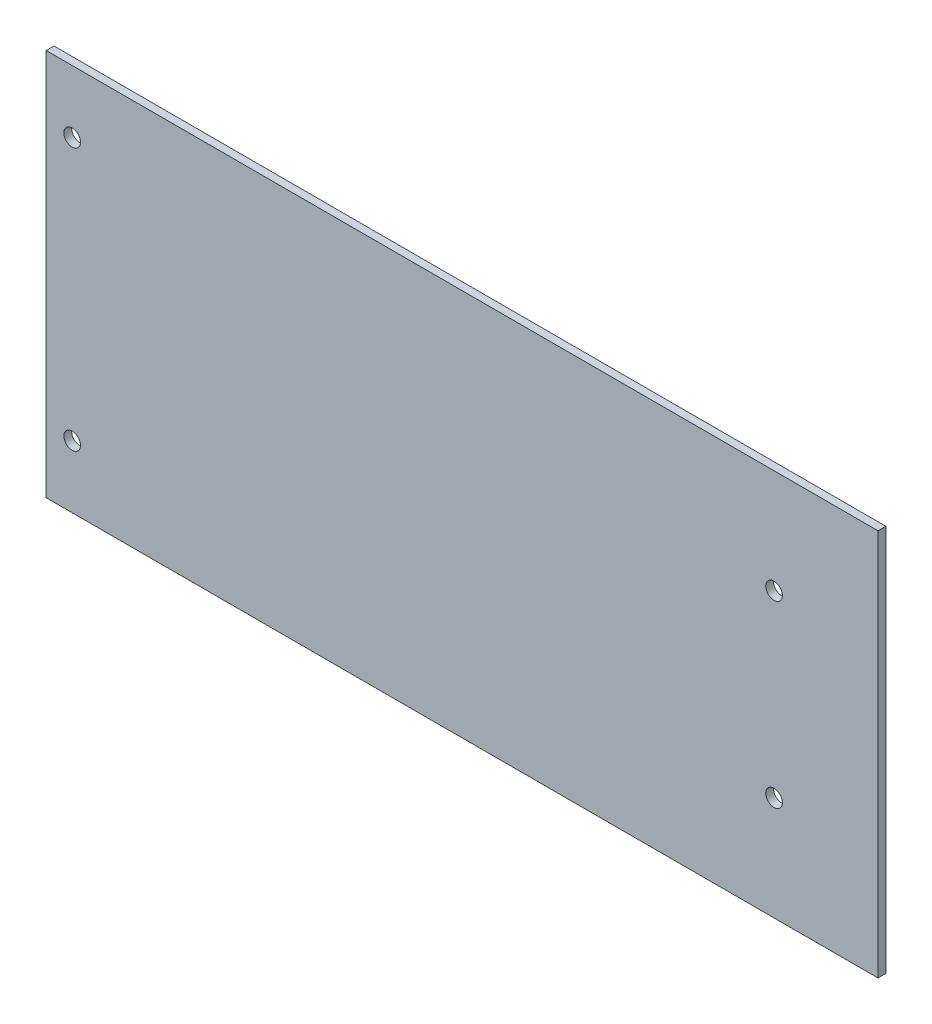
ISO-10303-21;
HEADER;
FILE_DESCRIPTION(('STEP AP214'),'2;1');
FILE_NAME('part.step','',(''),(''),'','','');
FILE_SCHEMA(('AUTOMOTIVE_DESIGN { 1 0 10303 214 1 1 1 1 }'));
ENDSEC;
DATA;
#1=APPLICATION_CONTEXT('core data for automotive mechanical design processes');
#2=APPLICATION_PROTOCOL_DEFINITION('international standard','automotive_design',2000,#1);
#3=PRODUCT_CONTEXT('',#1,'mechanical');
#4=PRODUCT('Part','Part','',(#3));
#5=PRODUCT_RELATED_PRODUCT_CATEGORY('part','',(#4));
#6=PRODUCT_DEFINITION_FORMATION('','',#4);
#7=PRODUCT_DEFINITION_CONTEXT('part definition',#1,'design');
#8=PRODUCT_DEFINITION('design','',#6,#7);
#9=PRODUCT_DEFINITION_SHAPE('','',#8);
#10=(LENGTH_UNIT() NAMED_UNIT(*) SI_UNIT(.MILLI.,.METRE.));
#11=(NAMED_UNIT(*) PLANE_ANGLE_UNIT() SI_UNIT($,.RADIAN.));
#12=(NAMED_UNIT(*) SI_UNIT($,.STERADIAN.) SOLID_ANGLE_UNIT());
#13=UNCERTAINTY_MEASURE_WITH_UNIT(LENGTH_MEASURE(1.E-05),#10,'distance_accuracy_value','');
#14=(GEOMETRIC_REPRESENTATION_CONTEXT(3) GLOBAL_UNCERTAINTY_ASSIGNED_CONTEXT((#13)) GLOBAL_UNIT_ASSIGNED_CONTEXT((#10,
#11,#12)) REPRESENTATION_CONTEXT('',''));
#15=CARTESIAN_POINT('',(0.,0.,0.));
#16=DIRECTION('',(0.,0.,1.));
#17=DIRECTION('',(1.,0.,0.));
#18=AXIS2_PLACEMENT_3D('',#15,#16,#17);
#19=CARTESIAN_POINT('',(0.,0.,1.5));
#20=DIRECTION('',(0.,0.,1.));
#21=DIRECTION('',(1.,0.,0.));
#22=AXIS2_PLACEMENT_3D('',#19,#20,#21);
#23=PLANE('',#22);
#24=CARTESIAN_POINT('',(-64.9627673140526,62.5,1.5));
#25=DIRECTION('',(0.,0.,1.));
#26=DIRECTION('',(1.,0.,0.));
#27=AXIS2_PLACEMENT_3D('',#24,#25,#26);
#28=CIRCLE('',#27,1.6);
#29=CARTESIAN_POINT('',(-63.3627673140526,62.5,1.5));
#30=VERTEX_POINT('',#29);
#31=EDGE_CURVE('E120',#30,#30,#28,.T.);
#32=ORIENTED_EDGE('',*,*,#31,.F.);
#33=EDGE_LOOP('',(#32));
#34=FACE_BOUND('',#33,.T.);
#35=CARTESIAN_POINT('',(70.0372326859474,54.5,1.5));
#36=DIRECTION('',(0.,0.,1.));
#37=DIRECTION('',(1.,0.,0.));
#38=AXIS2_PLACEMENT_3D('',#35,#36,#37);
#39=CIRCLE('',#38,1.60000000000001);
#40=CARTESIAN_POINT('',(71.6372326859474,54.5,1.5));
#41=VERTEX_POINT('',#40);
#42=EDGE_CURVE('E99',#41,#41,#39,.T.);
#43=ORIENTED_EDGE('',*,*,#42,.F.);
#44=EDGE_LOOP('',(#43));
#45=FACE_BOUND('',#44,.T.);
#46=DIRECTION('',(0.,-1.,0.));
#47=VECTOR('',#46,1.);
#48=CARTESIAN_POINT('',(-69.9627673140526,74.5,1.5));
#49=LINE('',#48,#47);
#50=CARTESIAN_POINT('',(-69.9627673140526,74.5,1.5));
#51=VERTEX_POINT('',#50);
#52=CARTESIAN_POINT('',(-69.9627673140526,0.,1.5));
#53=VERTEX_POINT('',#52);
#54=EDGE_CURVE('E84',#51,#53,#49,.T.);
#55=ORIENTED_EDGE('',*,*,#54,.T.);
#56=DIRECTION('',(1.,0.,0.));
#57=VECTOR('',#56,1.);
#58=CARTESIAN_POINT('',(-69.9627673140526,0.,1.5));
#59=LINE('',#58,#57);
#60=CARTESIAN_POINT('',(90.0372326859474,0.,1.5));
#61=VERTEX_POINT('',#60);
#62=EDGE_CURVE('E79',#53,#61,#59,.T.);
#63=ORIENTED_EDGE('',*,*,#62,.T.);
#64=DIRECTION('',(0.,1.,0.));
#65=VECTOR('',#64,1.);
#66=CARTESIAN_POINT('',(90.0372326859474,74.5,1.5));
#67=LINE('',#66,#65);
#68=CARTESIAN_POINT('',(90.0372326859474,74.5,1.5));
#69=VERTEX_POINT('',#68);
#70=EDGE_CURVE('E82',#61,#69,#67,.T.);
#71=ORIENTED_EDGE('',*,*,#70,.T.);
#72=DIRECTION('',(-1.,0.,0.));
#73=VECTOR('',#72,1.);
#74=CARTESIAN_POINT('',(-69.9627673140526,74.5,1.5));
#75=LINE('',#74,#73);
#76=EDGE_CURVE('E49',#69,#51,#75,.T.);
#77=ORIENTED_EDGE('',*,*,#76,.T.);
#78=EDGE_LOOP('',(#55,#63,#71,#77));
#79=FACE_BOUND('',#78,.T.);
#80=CARTESIAN_POINT('',(70.0372326859474,20.,1.5));
#81=DIRECTION('',(0.,0.,1.));
#82=DIRECTION('',(1.,0.,0.));
#83=AXIS2_PLACEMENT_3D('',#80,#81,#82);
#84=CIRCLE('',#83,1.6);
#85=CARTESIAN_POINT('',(71.6372326859474,20.,1.5));
#86=VERTEX_POINT('',#85);
#87=EDGE_CURVE('E114',#86,#86,#84,.T.);
#88=ORIENTED_EDGE('',*,*,#87,.F.);
#89=EDGE_LOOP('',(#88));
#90=FACE_BOUND('',#89,.T.);
#91=CARTESIAN_POINT('',(-64.9627673140526,12.,1.5));
#92=DIRECTION('',(0.,0.,1.));
#93=DIRECTION('',(1.,0.,0.));
#94=AXIS2_PLACEMENT_3D('',#91,#92,#93);
#95=CIRCLE('',#94,1.6);
#96=CARTESIAN_POINT('',(-63.3627673140526,12.,1.5));
#97=VERTEX_POINT('',#96);
#98=EDGE_CURVE('E126',#97,#97,#95,.T.);
#99=ORIENTED_EDGE('',*,*,#98,.F.);
#100=EDGE_LOOP('',(#99));
#101=FACE_BOUND('',#100,.T.);
#102=ADVANCED_FACE('F32',(#34,#45,#79,#90,#101),#23,.T.);
#103=CARTESIAN_POINT('',(0.,0.,0.));
#104=DIRECTION('',(0.,0.,1.));
#105=DIRECTION('',(1.,0.,0.));
#106=AXIS2_PLACEMENT_3D('',#103,#104,#105);
#107=PLANE('',#106);
#108=CARTESIAN_POINT('',(-64.9627673140526,62.5,0.));
#109=DIRECTION('',(0.,0.,1.));
#110=DIRECTION('',(1.,0.,0.));
#111=AXIS2_PLACEMENT_3D('',#108,#109,#110);
#112=CIRCLE('',#111,1.6);
#113=CARTESIAN_POINT('',(-63.3627673140526,62.5,0.));
#114=VERTEX_POINT('',#113);
#115=EDGE_CURVE('E123',#114,#114,#112,.T.);
#116=ORIENTED_EDGE('',*,*,#115,.T.);
#117=EDGE_LOOP('',(#116));
#118=FACE_BOUND('',#117,.T.);
#119=CARTESIAN_POINT('',(70.0372326859474,54.5,0.));
#120=DIRECTION('',(0.,0.,1.));
#121=DIRECTION('',(1.,0.,0.));
#122=AXIS2_PLACEMENT_3D('',#119,#120,#121);
#123=CIRCLE('',#122,1.60000000000001);
#124=CARTESIAN_POINT('',(71.6372326859474,54.5,0.));
#125=VERTEX_POINT('',#124);
#126=EDGE_CURVE('E111',#125,#125,#123,.T.);
#127=ORIENTED_EDGE('',*,*,#126,.T.);
#128=EDGE_LOOP('',(#127));
#129=FACE_BOUND('',#128,.T.);
#130=DIRECTION('',(0.,-1.,0.));
#131=VECTOR('',#130,1.);
#132=CARTESIAN_POINT('',(-69.9627673140526,74.5,0.));
#133=LINE('',#132,#131);
#134=CARTESIAN_POINT('',(-69.9627673140526,74.5,0.));
#135=VERTEX_POINT('',#134);
#136=CARTESIAN_POINT('',(-69.9627673140526,0.,0.));
#137=VERTEX_POINT('',#136);
#138=EDGE_CURVE('E96',#135,#137,#133,.T.);
#139=ORIENTED_EDGE('',*,*,#138,.F.);
#140=DIRECTION('',(-1.,0.,0.));
#141=VECTOR('',#140,1.);
#142=CARTESIAN_POINT('',(-69.9627673140526,74.5,0.));
#143=LINE('',#142,#141);
#144=CARTESIAN_POINT('',(90.0372326859474,74.5,0.));
#145=VERTEX_POINT('',#144);
#146=EDGE_CURVE('E72',#145,#135,#143,.T.);
#147=ORIENTED_EDGE('',*,*,#146,.F.);
#148=DIRECTION('',(0.,1.,0.));
#149=VECTOR('',#148,1.);
#150=CARTESIAN_POINT('',(90.0372326859474,74.5,0.));
#151=LINE('',#150,#149);
#152=CARTESIAN_POINT('',(90.0372326859474,0.,0.));
#153=VERTEX_POINT('',#152);
#154=EDGE_CURVE('E66',#153,#145,#151,.T.);
#155=ORIENTED_EDGE('',*,*,#154,.F.);
#156=DIRECTION('',(1.,0.,0.));
#157=VECTOR('',#156,1.);
#158=CARTESIAN_POINT('',(-69.9627673140526,0.,0.));
#159=LINE('',#158,#157);
#160=EDGE_CURVE('E88',#137,#153,#159,.T.);
#161=ORIENTED_EDGE('',*,*,#160,.F.);
#162=EDGE_LOOP('',(#139,#147,#155,#161));
#163=FACE_BOUND('',#162,.T.);
#164=CARTESIAN_POINT('',(70.0372326859474,20.,0.));
#165=DIRECTION('',(0.,0.,1.));
#166=DIRECTION('',(1.,0.,0.));
#167=AXIS2_PLACEMENT_3D('',#164,#165,#166);
#168=CIRCLE('',#167,1.6);
#169=CARTESIAN_POINT('',(71.6372326859474,20.,0.));
#170=VERTEX_POINT('',#169);
#171=EDGE_CURVE('E117',#170,#170,#168,.T.);
#172=ORIENTED_EDGE('',*,*,#171,.T.);
#173=EDGE_LOOP('',(#172));
#174=FACE_BOUND('',#173,.T.);
#175=CARTESIAN_POINT('',(-64.9627673140526,12.,0.));
#176=DIRECTION('',(0.,0.,1.));
#177=DIRECTION('',(1.,0.,0.));
#178=AXIS2_PLACEMENT_3D('',#175,#176,#177);
#179=CIRCLE('',#178,1.6);
#180=CARTESIAN_POINT('',(-63.3627673140526,12.,0.));
#181=VERTEX_POINT('',#180);
#182=EDGE_CURVE('E129',#181,#181,#179,.T.);
#183=ORIENTED_EDGE('',*,*,#182,.T.);
#184=EDGE_LOOP('',(#183));
#185=FACE_BOUND('',#184,.T.);
#186=ADVANCED_FACE('F107',(#118,#129,#163,#174,#185),#107,.F.);
#187=CARTESIAN_POINT('',(-69.9627673140526,74.5,1.5));
#188=DIRECTION('',(1.,0.,0.));
#189=DIRECTION('',(0.,1.,0.));
#190=AXIS2_PLACEMENT_3D('',#187,#188,#189);
#191=PLANE('',#190);
#192=ORIENTED_EDGE('',*,*,#138,.T.);
#193=DIRECTION('',(0.,0.,-1.));
#194=VECTOR('',#193,1.);
#195=CARTESIAN_POINT('',(-69.9627673140526,0.,1.5));
#196=LINE('',#195,#194);
#197=EDGE_CURVE('E11',#53,#137,#196,.T.);
#198=ORIENTED_EDGE('',*,*,#197,.F.);
#199=ORIENTED_EDGE('',*,*,#54,.F.);
#200=DIRECTION('',(0.,0.,-1.));
#201=VECTOR('',#200,1.);
#202=CARTESIAN_POINT('',(-69.9627673140526,74.5,1.5));
#203=LINE('',#202,#201);
#204=EDGE_CURVE('E92',#51,#135,#203,.T.);
#205=ORIENTED_EDGE('',*,*,#204,.T.);
#206=EDGE_LOOP('',(#192,#198,#199,#205));
#207=FACE_BOUND('',#206,.T.);
#208=ADVANCED_FACE('F34',(#207),#191,.F.);
#209=CARTESIAN_POINT('',(-69.9627673140526,0.,1.5));
#210=DIRECTION('',(0.,1.,0.));
#211=DIRECTION('',(0.,0.,1.));
#212=AXIS2_PLACEMENT_3D('',#209,#210,#211);
#213=PLANE('',#212);
#214=ORIENTED_EDGE('',*,*,#160,.T.);
#215=DIRECTION('',(0.,0.,-1.));
#216=VECTOR('',#215,1.);
#217=CARTESIAN_POINT('',(90.0372326859474,0.,1.5));
#218=LINE('',#217,#216);
#219=EDGE_CURVE('E41',#61,#153,#218,.T.);
#220=ORIENTED_EDGE('',*,*,#219,.F.);
#221=ORIENTED_EDGE('',*,*,#62,.F.);
#222=ORIENTED_EDGE('',*,*,#197,.T.);
#223=EDGE_LOOP('',(#214,#220,#221,#222));
#224=FACE_BOUND('',#223,.T.);
#225=ADVANCED_FACE('F87',(#224),#213,.F.);
#226=CARTESIAN_POINT('',(90.0372326859474,74.5,1.5));
#227=DIRECTION('',(-1.,0.,0.));
#228=DIRECTION('',(0.,-1.,0.));
#229=AXIS2_PLACEMENT_3D('',#226,#227,#228);
#230=PLANE('',#229);
#231=ORIENTED_EDGE('',*,*,#154,.T.);
#232=DIRECTION('',(0.,0.,-1.));
#233=VECTOR('',#232,1.);
#234=CARTESIAN_POINT('',(90.0372326859474,74.5,1.5));
#235=LINE('',#234,#233);
#236=EDGE_CURVE('E89',#69,#145,#235,.T.);
#237=ORIENTED_EDGE('',*,*,#236,.F.);
#238=ORIENTED_EDGE('',*,*,#70,.F.);
#239=ORIENTED_EDGE('',*,*,#219,.T.);
#240=EDGE_LOOP('',(#231,#237,#238,#239));
#241=FACE_BOUND('',#240,.T.);
#242=ADVANCED_FACE('F90',(#241),#230,.F.);
#243=CARTESIAN_POINT('',(-69.9627673140526,74.5,1.5));
#244=DIRECTION('',(0.,-1.,0.));
#245=DIRECTION('',(0.,0.,-1.));
#246=AXIS2_PLACEMENT_3D('',#243,#244,#245);
#247=PLANE('',#246);
#248=ORIENTED_EDGE('',*,*,#146,.T.);
#249=ORIENTED_EDGE('',*,*,#204,.F.);
#250=ORIENTED_EDGE('',*,*,#76,.F.);
#251=ORIENTED_EDGE('',*,*,#236,.T.);
#252=EDGE_LOOP('',(#248,#249,#250,#251));
#253=FACE_BOUND('',#252,.T.);
#254=ADVANCED_FACE('F104',(#253),#247,.F.);
#255=CARTESIAN_POINT('',(70.0372326859474,54.5,1.5));
#256=DIRECTION('',(0.,0.,-1.));
#257=DIRECTION('',(-1.,0.,0.));
#258=AXIS2_PLACEMENT_3D('',#255,#256,#257);
#259=CYLINDRICAL_SURFACE('',#258,1.60000000000001);
#260=ORIENTED_EDGE('',*,*,#42,.T.);
#261=EDGE_LOOP('',(#260));
#262=FACE_BOUND('',#261,.T.);
#263=ORIENTED_EDGE('',*,*,#126,.F.);
#264=EDGE_LOOP('',(#263));
#265=FACE_BOUND('',#264,.T.);
#266=ADVANCED_FACE('F149',(#262,#265),#259,.F.);
#267=CARTESIAN_POINT('',(70.0372326859474,20.,1.5));
#268=DIRECTION('',(0.,0.,-1.));
#269=DIRECTION('',(-1.,0.,0.));
#270=AXIS2_PLACEMENT_3D('',#267,#268,#269);
#271=CYLINDRICAL_SURFACE('',#270,1.6);
#272=ORIENTED_EDGE('',*,*,#87,.T.);
#273=EDGE_LOOP('',(#272));
#274=FACE_BOUND('',#273,.T.);
#275=ORIENTED_EDGE('',*,*,#171,.F.);
#276=EDGE_LOOP('',(#275));
#277=FACE_BOUND('',#276,.T.);
#278=ADVANCED_FACE('F195',(#274,#277),#271,.F.);
#279=CARTESIAN_POINT('',(-64.9627673140526,62.5,1.5));
#280=DIRECTION('',(0.,0.,-1.));
#281=DIRECTION('',(-1.,0.,0.));
#282=AXIS2_PLACEMENT_3D('',#279,#280,#281);
#283=CYLINDRICAL_SURFACE('',#282,1.6);
#284=ORIENTED_EDGE('',*,*,#31,.T.);
#285=EDGE_LOOP('',(#284));
#286=FACE_BOUND('',#285,.T.);
#287=ORIENTED_EDGE('',*,*,#115,.F.);
#288=EDGE_LOOP('',(#287));
#289=FACE_BOUND('',#288,.T.);
#290=ADVANCED_FACE('F203',(#286,#289),#283,.F.);
#291=CARTESIAN_POINT('',(-64.9627673140526,12.,1.5));
#292=DIRECTION('',(0.,0.,-1.));
#293=DIRECTION('',(-1.,0.,0.));
#294=AXIS2_PLACEMENT_3D('',#291,#292,#293);
#295=CYLINDRICAL_SURFACE('',#294,1.6);
#296=ORIENTED_EDGE('',*,*,#98,.T.);
#297=EDGE_LOOP('',(#296));
#298=FACE_BOUND('',#297,.T.);
#299=ORIENTED_EDGE('',*,*,#182,.F.);
#300=EDGE_LOOP('',(#299));
#301=FACE_BOUND('',#300,.T.);
#302=ADVANCED_FACE('F135',(#298,#301),#295,.F.);
#303=CLOSED_SHELL('',(#102,#186,#208,#225,#242,#254,#266,#278,#290,#302));
#304=MANIFOLD_SOLID_BREP('B2',#303);
#305=ADVANCED_BREP_SHAPE_REPRESENTATION('',(#18,#304),#14);
#306=SHAPE_DEFINITION_REPRESENTATION(#9,#305);
ENDSEC;
END-ISO-10303-21;
